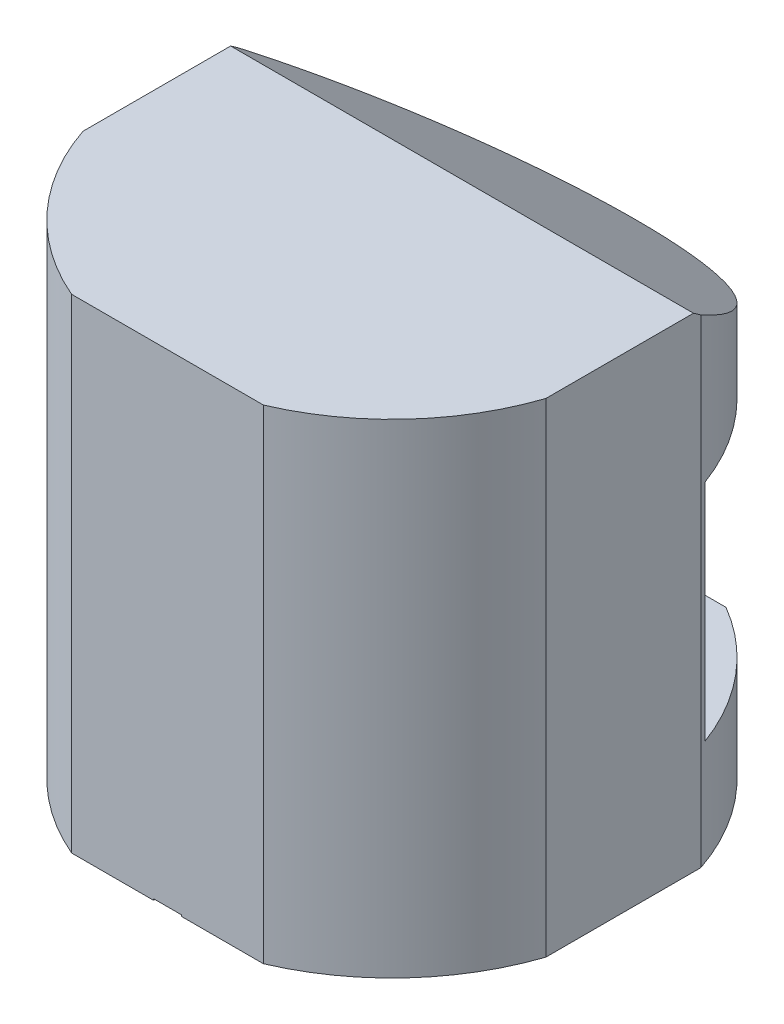
ISO-10303-21;
HEADER;
FILE_DESCRIPTION(('STEP AP214'),'2;1');
FILE_NAME('part.step','',(''),(''),'','','');
FILE_SCHEMA(('AUTOMOTIVE_DESIGN { 1 0 10303 214 1 1 1 1 }'));
ENDSEC;
DATA;
#1=APPLICATION_CONTEXT('core data for automotive mechanical design processes');
#2=APPLICATION_PROTOCOL_DEFINITION('international standard','automotive_design',2000,#1);
#3=PRODUCT_CONTEXT('',#1,'mechanical');
#4=PRODUCT('Part','Part','',(#3));
#5=PRODUCT_RELATED_PRODUCT_CATEGORY('part','',(#4));
#6=PRODUCT_DEFINITION_FORMATION('','',#4);
#7=PRODUCT_DEFINITION_CONTEXT('part definition',#1,'design');
#8=PRODUCT_DEFINITION('design','',#6,#7);
#9=PRODUCT_DEFINITION_SHAPE('','',#8);
#10=(LENGTH_UNIT() NAMED_UNIT(*) SI_UNIT(.MILLI.,.METRE.));
#11=(NAMED_UNIT(*) PLANE_ANGLE_UNIT() SI_UNIT($,.RADIAN.));
#12=(NAMED_UNIT(*) SI_UNIT($,.STERADIAN.) SOLID_ANGLE_UNIT());
#13=UNCERTAINTY_MEASURE_WITH_UNIT(LENGTH_MEASURE(1.E-05),#10,'distance_accuracy_value','');
#14=(GEOMETRIC_REPRESENTATION_CONTEXT(3) GLOBAL_UNCERTAINTY_ASSIGNED_CONTEXT((#13)) GLOBAL_UNIT_ASSIGNED_CONTEXT((#10,
#11,#12)) REPRESENTATION_CONTEXT('',''));
#15=CARTESIAN_POINT('',(0.,0.,0.));
#16=DIRECTION('',(0.,0.,1.));
#17=DIRECTION('',(1.,0.,0.));
#18=AXIS2_PLACEMENT_3D('',#15,#16,#17);
#19=CARTESIAN_POINT('',(0.,345.,0.));
#20=DIRECTION('',(0.,-1.,0.));
#21=DIRECTION('',(0.,0.,-1.));
#22=AXIS2_PLACEMENT_3D('',#19,#20,#21);
#23=CYLINDRICAL_SURFACE('',#22,174.);
#24=CARTESIAN_POINT('',(0.,0.,0.));
#25=DIRECTION('',(0.,1.,0.));
#26=DIRECTION('',(0.,0.,1.));
#27=AXIS2_PLACEMENT_3D('',#24,#25,#26);
#28=CIRCLE('',#27,174.);
#29=CARTESIAN_POINT('',(-165.,0.,55.2358579185658));
#30=VERTEX_POINT('',#29);
#31=CARTESIAN_POINT('',(-68.381283989115,0.,160.));
#32=VERTEX_POINT('',#31);
#33=EDGE_CURVE('E196',#30,#32,#28,.T.);
#34=ORIENTED_EDGE('',*,*,#33,.T.);
#35=DIRECTION('',(0.,-1.,0.));
#36=VECTOR('',#35,1.);
#37=CARTESIAN_POINT('',(-68.381283989115,345.,160.));
#38=LINE('',#37,#36);
#39=CARTESIAN_POINT('',(-68.381283989115,345.,160.));
#40=VERTEX_POINT('',#39);
#41=EDGE_CURVE('E239',#40,#32,#38,.T.);
#42=ORIENTED_EDGE('',*,*,#41,.F.);
#43=CARTESIAN_POINT('',(0.,345.,0.));
#44=DIRECTION('',(0.,1.,0.));
#45=DIRECTION('',(0.,0.,1.));
#46=AXIS2_PLACEMENT_3D('',#43,#44,#45);
#47=CIRCLE('',#46,174.);
#48=CARTESIAN_POINT('',(-165.,345.,55.2358579185658));
#49=VERTEX_POINT('',#48);
#50=EDGE_CURVE('E197',#49,#40,#47,.T.);
#51=ORIENTED_EDGE('',*,*,#50,.F.);
#52=DIRECTION('',(0.,-1.,0.));
#53=VECTOR('',#52,1.);
#54=CARTESIAN_POINT('',(-165.,345.,55.2358579185658));
#55=LINE('',#54,#53);
#56=EDGE_CURVE('E210',#49,#30,#55,.T.);
#57=ORIENTED_EDGE('',*,*,#56,.T.);
#58=EDGE_LOOP('',(#34,#42,#51,#57));
#59=FACE_BOUND('',#58,.T.);
#60=ADVANCED_FACE('F32',(#59),#23,.T.);
#61=CARTESIAN_POINT('',(-68.381283989115,345.,160.));
#62=DIRECTION('',(0.,0.,-1.));
#63=DIRECTION('',(-1.,0.,0.));
#64=AXIS2_PLACEMENT_3D('',#61,#62,#63);
#65=PLANE('',#64);
#66=DIRECTION('',(1.,0.,0.));
#67=VECTOR('',#66,1.);
#68=CARTESIAN_POINT('',(-68.381283989115,0.,160.));
#69=LINE('',#68,#67);
#70=CARTESIAN_POINT('',(-10.,0.,160.));
#71=VERTEX_POINT('',#70);
#72=EDGE_CURVE('E214',#32,#71,#69,.T.);
#73=ORIENTED_EDGE('',*,*,#72,.T.);
#74=DIRECTION('',(0.,-1.,0.));
#75=VECTOR('',#74,1.);
#76=CARTESIAN_POINT('',(-10.,1.,160.));
#77=LINE('',#76,#75);
#78=CARTESIAN_POINT('',(-10.,1.,160.));
#79=VERTEX_POINT('',#78);
#80=EDGE_CURVE('E166',#79,#71,#77,.T.);
#81=ORIENTED_EDGE('',*,*,#80,.F.);
#82=DIRECTION('',(-1.,0.,0.));
#83=VECTOR('',#82,1.);
#84=CARTESIAN_POINT('',(-10.,1.,160.));
#85=LINE('',#84,#83);
#86=CARTESIAN_POINT('',(10.,1.,160.));
#87=VERTEX_POINT('',#86);
#88=EDGE_CURVE('E144',#87,#79,#85,.T.);
#89=ORIENTED_EDGE('',*,*,#88,.F.);
#90=DIRECTION('',(0.,-1.,0.));
#91=VECTOR('',#90,1.);
#92=CARTESIAN_POINT('',(10.,1.,160.));
#93=LINE('',#92,#91);
#94=CARTESIAN_POINT('',(10.,0.,160.));
#95=VERTEX_POINT('',#94);
#96=EDGE_CURVE('E169',#87,#95,#93,.T.);
#97=ORIENTED_EDGE('',*,*,#96,.T.);
#98=CARTESIAN_POINT('',(68.381283989115,0.,160.));
#99=VERTEX_POINT('',#98);
#100=EDGE_CURVE('E213',#95,#99,#69,.T.);
#101=ORIENTED_EDGE('',*,*,#100,.T.);
#102=DIRECTION('',(0.,-1.,0.));
#103=VECTOR('',#102,1.);
#104=CARTESIAN_POINT('',(68.381283989115,345.,160.));
#105=LINE('',#104,#103);
#106=CARTESIAN_POINT('',(68.381283989115,345.,160.));
#107=VERTEX_POINT('',#106);
#108=EDGE_CURVE('E236',#107,#99,#105,.T.);
#109=ORIENTED_EDGE('',*,*,#108,.F.);
#110=DIRECTION('',(1.,0.,0.));
#111=VECTOR('',#110,1.);
#112=CARTESIAN_POINT('',(-68.381283989115,345.,160.));
#113=LINE('',#112,#111);
#114=EDGE_CURVE('E200',#40,#107,#113,.T.);
#115=ORIENTED_EDGE('',*,*,#114,.F.);
#116=ORIENTED_EDGE('',*,*,#41,.T.);
#117=EDGE_LOOP('',(#73,#81,#89,#97,#101,#109,#115,#116));
#118=FACE_BOUND('',#117,.T.);
#119=ADVANCED_FACE('F286',(#118),#65,.F.);
#120=CARTESIAN_POINT('',(0.,345.,0.));
#121=DIRECTION('',(0.,-1.,0.));
#122=DIRECTION('',(0.,0.,-1.));
#123=AXIS2_PLACEMENT_3D('',#120,#121,#122);
#124=CYLINDRICAL_SURFACE('',#123,174.);
#125=CARTESIAN_POINT('',(0.,0.,0.));
#126=DIRECTION('',(0.,1.,0.));
#127=DIRECTION('',(0.,0.,1.));
#128=AXIS2_PLACEMENT_3D('',#125,#126,#127);
#129=CIRCLE('',#128,174.);
#130=CARTESIAN_POINT('',(165.,0.,55.2358579185658));
#131=VERTEX_POINT('',#130);
#132=EDGE_CURVE('E217',#99,#131,#129,.T.);
#133=ORIENTED_EDGE('',*,*,#132,.T.);
#134=DIRECTION('',(0.,-1.,0.));
#135=VECTOR('',#134,1.);
#136=CARTESIAN_POINT('',(165.,345.,55.2358579185658));
#137=LINE('',#136,#135);
#138=CARTESIAN_POINT('',(165.,345.,55.2358579185658));
#139=VERTEX_POINT('',#138);
#140=EDGE_CURVE('E233',#139,#131,#137,.T.);
#141=ORIENTED_EDGE('',*,*,#140,.F.);
#142=CARTESIAN_POINT('',(0.,345.,0.));
#143=DIRECTION('',(0.,1.,0.));
#144=DIRECTION('',(0.,0.,1.));
#145=AXIS2_PLACEMENT_3D('',#142,#143,#144);
#146=CIRCLE('',#145,174.);
#147=EDGE_CURVE('E203',#107,#139,#146,.T.);
#148=ORIENTED_EDGE('',*,*,#147,.F.);
#149=ORIENTED_EDGE('',*,*,#108,.T.);
#150=EDGE_LOOP('',(#133,#141,#148,#149));
#151=FACE_BOUND('',#150,.T.);
#152=ADVANCED_FACE('F282',(#151),#124,.T.);
#153=CARTESIAN_POINT('',(165.,345.,55.2358579185658));
#154=DIRECTION('',(-1.,0.,0.));
#155=DIRECTION('',(0.,0.,1.));
#156=AXIS2_PLACEMENT_3D('',#153,#154,#155);
#157=PLANE('',#156);
#158=DIRECTION('',(0.,-1.,0.));
#159=VECTOR('',#158,1.);
#160=CARTESIAN_POINT('',(165.,345.,-55.2358579185659));
#161=LINE('',#160,#159);
#162=CARTESIAN_POINT('',(165.,341.333812816425,-55.2358579185659));
#163=VERTEX_POINT('',#162);
#164=CARTESIAN_POINT('',(165.,0.,-55.2358579185659));
#165=VERTEX_POINT('',#164);
#166=EDGE_CURVE('E231',#163,#165,#161,.T.);
#167=ORIENTED_EDGE('',*,*,#166,.F.);
#168=DIRECTION('',(0.,0.573576436351042,0.819152044288995));
#169=VECTOR('',#168,1.);
#170=CARTESIAN_POINT('',(165.,345.,-50.));
#171=LINE('',#170,#169);
#172=CARTESIAN_POINT('',(165.,345.,-50.));
#173=VERTEX_POINT('',#172);
#174=EDGE_CURVE('E182',#163,#173,#171,.T.);
#175=ORIENTED_EDGE('',*,*,#174,.T.);
#176=DIRECTION('',(0.,0.,-1.));
#177=VECTOR('',#176,1.);
#178=CARTESIAN_POINT('',(165.,345.,55.2358579185658));
#179=LINE('',#178,#177);
#180=EDGE_CURVE('E205',#139,#173,#179,.T.);
#181=ORIENTED_EDGE('',*,*,#180,.F.);
#182=ORIENTED_EDGE('',*,*,#140,.T.);
#183=DIRECTION('',(0.,0.,-1.));
#184=VECTOR('',#183,1.);
#185=CARTESIAN_POINT('',(165.,0.,55.2358579185658));
#186=LINE('',#185,#184);
#187=EDGE_CURVE('E219',#131,#165,#186,.T.);
#188=ORIENTED_EDGE('',*,*,#187,.T.);
#189=EDGE_LOOP('',(#167,#175,#181,#182,#188));
#190=FACE_BOUND('',#189,.T.);
#191=ADVANCED_FACE('F275',(#190),#157,.F.);
#192=CARTESIAN_POINT('',(0.,345.,0.));
#193=DIRECTION('',(0.,-1.,0.));
#194=DIRECTION('',(0.,0.,-1.));
#195=AXIS2_PLACEMENT_3D('',#192,#193,#194);
#196=CYLINDRICAL_SURFACE('',#195,174.);
#197=DIRECTION('',(0.,-1.,0.));
#198=VECTOR('',#197,1.);
#199=CARTESIAN_POINT('',(-163.327891065794,345.,-60.));
#200=LINE('',#199,#198);
#201=CARTESIAN_POINT('',(-163.327891065794,235.,-60.));
#202=VERTEX_POINT('',#201);
#203=CARTESIAN_POINT('',(-163.327891065794,75.,-60.));
#204=VERTEX_POINT('',#203);
#205=EDGE_CURVE('E11',#202,#204,#200,.T.);
#206=ORIENTED_EDGE('',*,*,#205,.T.);
#207=CARTESIAN_POINT('',(0.,75.,0.));
#208=DIRECTION('',(0.,-1.,0.));
#209=DIRECTION('',(0.,0.,-1.));
#210=AXIS2_PLACEMENT_3D('',#207,#208,#209);
#211=CIRCLE('',#210,174.);
#212=CARTESIAN_POINT('',(-88.1816307401944,75.,-150.));
#213=VERTEX_POINT('',#212);
#214=EDGE_CURVE('E39',#204,#213,#211,.T.);
#215=ORIENTED_EDGE('',*,*,#214,.T.);
#216=DIRECTION('',(0.,-1.,0.));
#217=VECTOR('',#216,1.);
#218=CARTESIAN_POINT('',(-88.1816307401944,345.,-150.));
#219=LINE('',#218,#217);
#220=CARTESIAN_POINT('',(-88.1816307401944,0.,-150.));
#221=VERTEX_POINT('',#220);
#222=EDGE_CURVE('E190',#213,#221,#219,.T.);
#223=ORIENTED_EDGE('',*,*,#222,.T.);
#224=CARTESIAN_POINT('',(0.,0.,0.));
#225=DIRECTION('',(0.,1.,0.));
#226=DIRECTION('',(0.,0.,1.));
#227=AXIS2_PLACEMENT_3D('',#224,#225,#226);
#228=CIRCLE('',#227,174.);
#229=CARTESIAN_POINT('',(-165.,0.,-55.2358579185658));
#230=VERTEX_POINT('',#229);
#231=EDGE_CURVE('E222',#221,#230,#228,.T.);
#232=ORIENTED_EDGE('',*,*,#231,.T.);
#233=DIRECTION('',(0.,-1.,0.));
#234=VECTOR('',#233,1.);
#235=CARTESIAN_POINT('',(-165.,345.,-55.2358579185658));
#236=LINE('',#235,#234);
#237=CARTESIAN_POINT('',(-165.,341.333812816425,-55.2358579185658));
#238=VERTEX_POINT('',#237);
#239=EDGE_CURVE('E229',#238,#230,#236,.T.);
#240=ORIENTED_EDGE('',*,*,#239,.F.);
#241=CARTESIAN_POINT('',(0.,380.010376910485,0.));
#242=DIRECTION('',(0.,-0.819152044288995,0.573576436351042));
#243=DIRECTION('',(0.,-0.573576436351042,-0.819152044288995));
#244=AXIS2_PLACEMENT_3D('',#241,#242,#243);
#245=ELLIPSE('',#244,212.414778444493,174.);
#246=EDGE_CURVE('E193',#238,#163,#245,.T.);
#247=ORIENTED_EDGE('',*,*,#246,.T.);
#248=ORIENTED_EDGE('',*,*,#166,.T.);
#249=CARTESIAN_POINT('',(88.1816307401944,0.,-150.));
#250=VERTEX_POINT('',#249);
#251=EDGE_CURVE('E223',#165,#250,#228,.T.);
#252=ORIENTED_EDGE('',*,*,#251,.T.);
#253=DIRECTION('',(0.,-1.,0.));
#254=VECTOR('',#253,1.);
#255=CARTESIAN_POINT('',(88.1816307401944,345.,-150.));
#256=LINE('',#255,#254);
#257=CARTESIAN_POINT('',(88.1816307401944,75.,-150.));
#258=VERTEX_POINT('',#257);
#259=EDGE_CURVE('E187',#250,#258,#256,.F.);
#260=ORIENTED_EDGE('',*,*,#259,.T.);
#261=CARTESIAN_POINT('',(163.327891065794,75.,-60.));
#262=VERTEX_POINT('',#261);
#263=EDGE_CURVE('E245',#258,#262,#211,.T.);
#264=ORIENTED_EDGE('',*,*,#263,.T.);
#265=DIRECTION('',(0.,-1.,0.));
#266=VECTOR('',#265,1.);
#267=CARTESIAN_POINT('',(163.327891065794,345.,-60.));
#268=LINE('',#267,#266);
#269=CARTESIAN_POINT('',(163.327891065794,235.,-60.));
#270=VERTEX_POINT('',#269);
#271=EDGE_CURVE('E248',#262,#270,#268,.F.);
#272=ORIENTED_EDGE('',*,*,#271,.T.);
#273=CARTESIAN_POINT('',(0.,235.,0.));
#274=DIRECTION('',(0.,1.,0.));
#275=DIRECTION('',(0.,0.,1.));
#276=AXIS2_PLACEMENT_3D('',#273,#274,#275);
#277=CIRCLE('',#276,174.);
#278=EDGE_CURVE('E250',#270,#202,#277,.T.);
#279=ORIENTED_EDGE('',*,*,#278,.T.);
#280=EDGE_LOOP('',(#206,#215,#223,#232,#240,#247,#248,#252,#260,#264,#272,#279));
#281=FACE_BOUND('',#280,.T.);
#282=ADVANCED_FACE('F255',(#281),#196,.T.);
#283=CARTESIAN_POINT('',(-165.,345.,55.2358579185658));
#284=DIRECTION('',(1.,0.,0.));
#285=DIRECTION('',(0.,0.,-1.));
#286=AXIS2_PLACEMENT_3D('',#283,#284,#285);
#287=PLANE('',#286);
#288=DIRECTION('',(0.,0.,1.));
#289=VECTOR('',#288,1.);
#290=CARTESIAN_POINT('',(-165.,345.,55.2358579185658));
#291=LINE('',#290,#289);
#292=CARTESIAN_POINT('',(-165.,345.,-50.));
#293=VERTEX_POINT('',#292);
#294=EDGE_CURVE('E208',#293,#49,#291,.T.);
#295=ORIENTED_EDGE('',*,*,#294,.F.);
#296=DIRECTION('',(0.,0.573576436351042,0.819152044288995));
#297=VECTOR('',#296,1.);
#298=CARTESIAN_POINT('',(-165.,345.,-50.));
#299=LINE('',#298,#297);
#300=EDGE_CURVE('E54',#238,#293,#299,.T.);
#301=ORIENTED_EDGE('',*,*,#300,.F.);
#302=ORIENTED_EDGE('',*,*,#239,.T.);
#303=DIRECTION('',(0.,0.,1.));
#304=VECTOR('',#303,1.);
#305=CARTESIAN_POINT('',(-165.,0.,55.2358579185658));
#306=LINE('',#305,#304);
#307=EDGE_CURVE('E201',#230,#30,#306,.T.);
#308=ORIENTED_EDGE('',*,*,#307,.T.);
#309=ORIENTED_EDGE('',*,*,#56,.F.);
#310=EDGE_LOOP('',(#295,#301,#302,#308,#309));
#311=FACE_BOUND('',#310,.T.);
#312=ADVANCED_FACE('F296',(#311),#287,.F.);
#313=CARTESIAN_POINT('',(0.,345.,0.));
#314=DIRECTION('',(0.,1.,0.));
#315=DIRECTION('',(0.,0.,1.));
#316=AXIS2_PLACEMENT_3D('',#313,#314,#315);
#317=PLANE('',#316);
#318=DIRECTION('',(-1.,0.,0.));
#319=VECTOR('',#318,1.);
#320=CARTESIAN_POINT('',(165.,345.,-50.));
#321=LINE('',#320,#319);
#322=EDGE_CURVE('E185',#173,#293,#321,.T.);
#323=ORIENTED_EDGE('',*,*,#322,.T.);
#324=ORIENTED_EDGE('',*,*,#294,.T.);
#325=ORIENTED_EDGE('',*,*,#50,.T.);
#326=ORIENTED_EDGE('',*,*,#114,.T.);
#327=ORIENTED_EDGE('',*,*,#147,.T.);
#328=ORIENTED_EDGE('',*,*,#180,.T.);
#329=EDGE_LOOP('',(#323,#324,#325,#326,#327,#328));
#330=FACE_BOUND('',#329,.T.);
#331=ADVANCED_FACE('F298',(#330),#317,.T.);
#332=CARTESIAN_POINT('',(0.,0.,0.));
#333=DIRECTION('',(0.,1.,0.));
#334=DIRECTION('',(0.,0.,1.));
#335=AXIS2_PLACEMENT_3D('',#332,#333,#334);
#336=PLANE('',#335);
#337=DIRECTION('',(1.,0.,0.));
#338=VECTOR('',#337,1.);
#339=CARTESIAN_POINT('',(-10.,0.,139.));
#340=LINE('',#339,#338);
#341=CARTESIAN_POINT('',(-10.,0.,139.));
#342=VERTEX_POINT('',#341);
#343=CARTESIAN_POINT('',(10.,0.,139.));
#344=VERTEX_POINT('',#343);
#345=EDGE_CURVE('E159',#342,#344,#340,.T.);
#346=ORIENTED_EDGE('',*,*,#345,.F.);
#347=DIRECTION('',(0.,0.,-1.));
#348=VECTOR('',#347,1.);
#349=CARTESIAN_POINT('',(-10.,0.,160.));
#350=LINE('',#349,#348);
#351=EDGE_CURVE('E46',#71,#342,#350,.T.);
#352=ORIENTED_EDGE('',*,*,#351,.F.);
#353=ORIENTED_EDGE('',*,*,#72,.F.);
#354=ORIENTED_EDGE('',*,*,#33,.F.);
#355=ORIENTED_EDGE('',*,*,#307,.F.);
#356=ORIENTED_EDGE('',*,*,#231,.F.);
#357=DIRECTION('',(1.,0.,0.));
#358=VECTOR('',#357,1.);
#359=CARTESIAN_POINT('',(0.,0.,-150.));
#360=LINE('',#359,#358);
#361=EDGE_CURVE('E242',#221,#250,#360,.T.);
#362=ORIENTED_EDGE('',*,*,#361,.T.);
#363=ORIENTED_EDGE('',*,*,#251,.F.);
#364=ORIENTED_EDGE('',*,*,#187,.F.);
#365=ORIENTED_EDGE('',*,*,#132,.F.);
#366=ORIENTED_EDGE('',*,*,#100,.F.);
#367=DIRECTION('',(0.,0.,1.));
#368=VECTOR('',#367,1.);
#369=CARTESIAN_POINT('',(10.,0.,160.));
#370=LINE('',#369,#368);
#371=EDGE_CURVE('E157',#344,#95,#370,.T.);
#372=ORIENTED_EDGE('',*,*,#371,.F.);
#373=EDGE_LOOP('',(#346,#352,#353,#354,#355,#356,#362,#363,#364,#365,#366,#372));
#374=FACE_BOUND('',#373,.T.);
#375=ADVANCED_FACE('F269',(#374),#336,.F.);
#376=CARTESIAN_POINT('',(165.,235.,-174.));
#377=DIRECTION('',(0.,1.,0.));
#378=DIRECTION('',(0.,0.,1.));
#379=AXIS2_PLACEMENT_3D('',#376,#377,#378);
#380=PLANE('',#379);
#381=DIRECTION('',(-1.,0.,0.));
#382=VECTOR('',#381,1.);
#383=CARTESIAN_POINT('',(165.,235.,-60.));
#384=LINE('',#383,#382);
#385=EDGE_CURVE('E176',#270,#202,#384,.T.);
#386=ORIENTED_EDGE('',*,*,#385,.T.);
#387=ORIENTED_EDGE('',*,*,#278,.F.);
#388=EDGE_LOOP('',(#386,#387));
#389=FACE_BOUND('',#388,.T.);
#390=ADVANCED_FACE('F325',(#389),#380,.F.);
#391=CARTESIAN_POINT('',(165.,150.,-60.));
#392=DIRECTION('',(0.,0.,1.));
#393=DIRECTION('',(1.,0.,0.));
#394=AXIS2_PLACEMENT_3D('',#391,#392,#393);
#395=PLANE('',#394);
#396=ORIENTED_EDGE('',*,*,#385,.F.);
#397=ORIENTED_EDGE('',*,*,#271,.F.);
#398=DIRECTION('',(1.,0.,0.));
#399=VECTOR('',#398,1.);
#400=CARTESIAN_POINT('',(-200.,75.,-60.));
#401=LINE('',#400,#399);
#402=EDGE_CURVE('E168',#204,#262,#401,.T.);
#403=ORIENTED_EDGE('',*,*,#402,.F.);
#404=ORIENTED_EDGE('',*,*,#205,.F.);
#405=EDGE_LOOP('',(#396,#397,#403,#404));
#406=FACE_BOUND('',#405,.T.);
#407=ADVANCED_FACE('F264',(#406),#395,.F.);
#408=CARTESIAN_POINT('',(165.,75.,-150.));
#409=DIRECTION('',(0.,-1.,0.));
#410=DIRECTION('',(0.,0.,-1.));
#411=AXIS2_PLACEMENT_3D('',#408,#409,#410);
#412=PLANE('',#411);
#413=DIRECTION('',(-1.,0.,0.));
#414=VECTOR('',#413,1.);
#415=CARTESIAN_POINT('',(165.,75.,-150.));
#416=LINE('',#415,#414);
#417=EDGE_CURVE('E175',#258,#213,#416,.T.);
#418=ORIENTED_EDGE('',*,*,#417,.T.);
#419=ORIENTED_EDGE('',*,*,#214,.F.);
#420=ORIENTED_EDGE('',*,*,#402,.T.);
#421=ORIENTED_EDGE('',*,*,#263,.F.);
#422=EDGE_LOOP('',(#418,#419,#420,#421));
#423=FACE_BOUND('',#422,.T.);
#424=ADVANCED_FACE('F260',(#423),#412,.F.);
#425=CARTESIAN_POINT('',(165.,0.,-150.));
#426=DIRECTION('',(0.,0.,1.));
#427=DIRECTION('',(1.,0.,0.));
#428=AXIS2_PLACEMENT_3D('',#425,#426,#427);
#429=PLANE('',#428);
#430=ORIENTED_EDGE('',*,*,#417,.F.);
#431=ORIENTED_EDGE('',*,*,#259,.F.);
#432=ORIENTED_EDGE('',*,*,#361,.F.);
#433=ORIENTED_EDGE('',*,*,#222,.F.);
#434=EDGE_LOOP('',(#430,#431,#432,#433));
#435=FACE_BOUND('',#434,.T.);
#436=ADVANCED_FACE('F266',(#435),#429,.F.);
#437=CARTESIAN_POINT('',(165.,345.,-50.));
#438=DIRECTION('',(0.,-0.819152044288995,0.573576436351042));
#439=DIRECTION('',(0.,-0.573576436351042,-0.819152044288995));
#440=AXIS2_PLACEMENT_3D('',#437,#438,#439);
#441=PLANE('',#440);
#442=ORIENTED_EDGE('',*,*,#300,.T.);
#443=ORIENTED_EDGE('',*,*,#322,.F.);
#444=ORIENTED_EDGE('',*,*,#174,.F.);
#445=ORIENTED_EDGE('',*,*,#246,.F.);
#446=EDGE_LOOP('',(#442,#443,#444,#445));
#447=FACE_BOUND('',#446,.T.);
#448=ADVANCED_FACE('F299',(#447),#441,.F.);
#449=CARTESIAN_POINT('',(-10.,1.,160.));
#450=DIRECTION('',(-1.,0.,0.));
#451=DIRECTION('',(0.,0.,1.));
#452=AXIS2_PLACEMENT_3D('',#449,#450,#451);
#453=PLANE('',#452);
#454=ORIENTED_EDGE('',*,*,#351,.T.);
#455=DIRECTION('',(0.,-1.,0.));
#456=VECTOR('',#455,1.);
#457=CARTESIAN_POINT('',(-10.,1.,139.));
#458=LINE('',#457,#456);
#459=CARTESIAN_POINT('',(-10.,1.,139.));
#460=VERTEX_POINT('',#459);
#461=EDGE_CURVE('E134',#460,#342,#458,.T.);
#462=ORIENTED_EDGE('',*,*,#461,.F.);
#463=DIRECTION('',(0.,0.,-1.));
#464=VECTOR('',#463,1.);
#465=CARTESIAN_POINT('',(-10.,1.,160.));
#466=LINE('',#465,#464);
#467=EDGE_CURVE('E138',#79,#460,#466,.T.);
#468=ORIENTED_EDGE('',*,*,#467,.F.);
#469=ORIENTED_EDGE('',*,*,#80,.T.);
#470=EDGE_LOOP('',(#454,#462,#468,#469));
#471=FACE_BOUND('',#470,.T.);
#472=ADVANCED_FACE('F136',(#471),#453,.F.);
#473=CARTESIAN_POINT('',(10.,1.,160.));
#474=DIRECTION('',(1.,0.,0.));
#475=DIRECTION('',(0.,0.,-1.));
#476=AXIS2_PLACEMENT_3D('',#473,#474,#475);
#477=PLANE('',#476);
#478=ORIENTED_EDGE('',*,*,#371,.T.);
#479=ORIENTED_EDGE('',*,*,#96,.F.);
#480=DIRECTION('',(0.,0.,1.));
#481=VECTOR('',#480,1.);
#482=CARTESIAN_POINT('',(10.,1.,160.));
#483=LINE('',#482,#481);
#484=CARTESIAN_POINT('',(10.,1.,139.));
#485=VERTEX_POINT('',#484);
#486=EDGE_CURVE('E152',#485,#87,#483,.T.);
#487=ORIENTED_EDGE('',*,*,#486,.F.);
#488=DIRECTION('',(0.,-1.,0.));
#489=VECTOR('',#488,1.);
#490=CARTESIAN_POINT('',(10.,1.,139.));
#491=LINE('',#490,#489);
#492=EDGE_CURVE('E143',#485,#344,#491,.T.);
#493=ORIENTED_EDGE('',*,*,#492,.T.);
#494=EDGE_LOOP('',(#478,#479,#487,#493));
#495=FACE_BOUND('',#494,.T.);
#496=ADVANCED_FACE('F288',(#495),#477,.F.);
#497=CARTESIAN_POINT('',(-10.,1.,139.));
#498=DIRECTION('',(0.,0.,-1.));
#499=DIRECTION('',(-1.,0.,0.));
#500=AXIS2_PLACEMENT_3D('',#497,#498,#499);
#501=PLANE('',#500);
#502=ORIENTED_EDGE('',*,*,#345,.T.);
#503=ORIENTED_EDGE('',*,*,#492,.F.);
#504=DIRECTION('',(1.,0.,0.));
#505=VECTOR('',#504,1.);
#506=CARTESIAN_POINT('',(-10.,1.,139.));
#507=LINE('',#506,#505);
#508=EDGE_CURVE('E147',#460,#485,#507,.T.);
#509=ORIENTED_EDGE('',*,*,#508,.F.);
#510=ORIENTED_EDGE('',*,*,#461,.T.);
#511=EDGE_LOOP('',(#502,#503,#509,#510));
#512=FACE_BOUND('',#511,.T.);
#513=ADVANCED_FACE('F148',(#512),#501,.F.);
#514=CARTESIAN_POINT('',(0.,1.,0.));
#515=DIRECTION('',(0.,-1.,0.));
#516=DIRECTION('',(0.,0.,-1.));
#517=AXIS2_PLACEMENT_3D('',#514,#515,#516);
#518=PLANE('',#517);
#519=ORIENTED_EDGE('',*,*,#467,.T.);
#520=ORIENTED_EDGE('',*,*,#508,.T.);
#521=ORIENTED_EDGE('',*,*,#486,.T.);
#522=ORIENTED_EDGE('',*,*,#88,.T.);
#523=EDGE_LOOP('',(#519,#520,#521,#522));
#524=FACE_BOUND('',#523,.T.);
#525=ADVANCED_FACE('F154',(#524),#518,.T.);
#526=CLOSED_SHELL('',(#60,#119,#152,#191,#282,#312,#331,#375,#390,#407,#424,#436,#448,#472,#496,
#513,#525));
#527=MANIFOLD_SOLID_BREP('B2',#526);
#528=ADVANCED_BREP_SHAPE_REPRESENTATION('',(#18,#527),#14);
#529=SHAPE_DEFINITION_REPRESENTATION(#9,#528);
ENDSEC;
END-ISO-10303-21;
